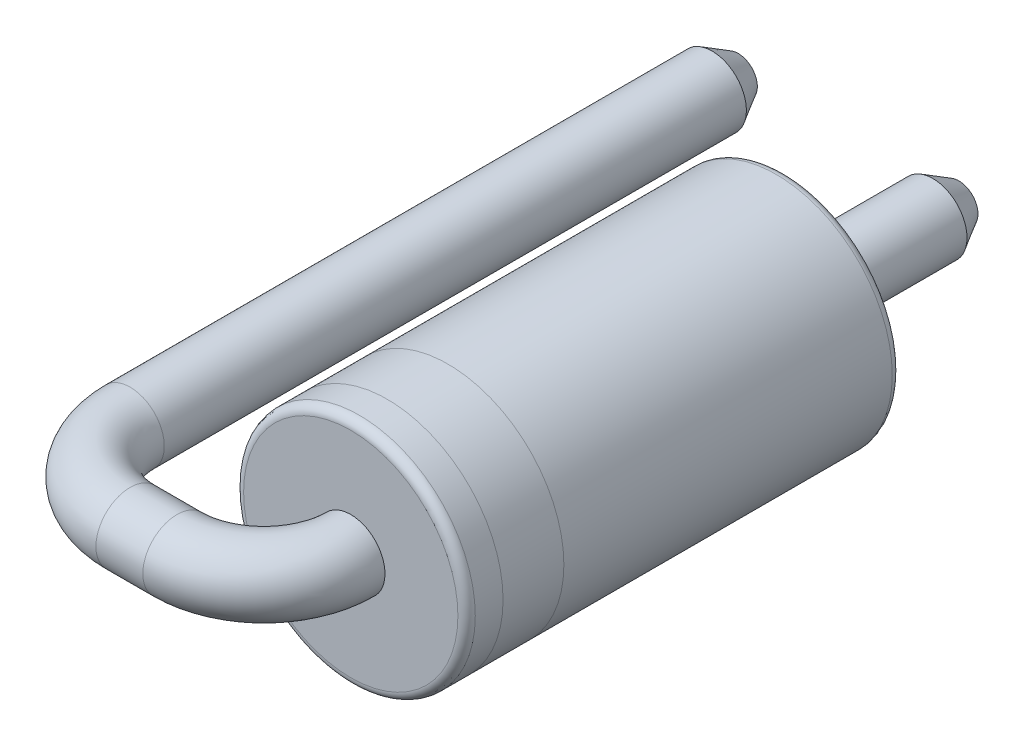
ISO-10303-21;
HEADER;
FILE_DESCRIPTION(('STEP AP214'),'2;1');
FILE_NAME('part.step','',(''),(''),'','','');
FILE_SCHEMA(('AUTOMOTIVE_DESIGN { 1 0 10303 214 1 1 1 1 }'));
ENDSEC;
DATA;
#1=APPLICATION_CONTEXT('core data for automotive mechanical design processes');
#2=APPLICATION_PROTOCOL_DEFINITION('international standard','automotive_design',2000,#1);
#3=PRODUCT_CONTEXT('',#1,'mechanical');
#4=PRODUCT('Part','Part','',(#3));
#5=PRODUCT_RELATED_PRODUCT_CATEGORY('part','',(#4));
#6=PRODUCT_DEFINITION_FORMATION('','',#4);
#7=PRODUCT_DEFINITION_CONTEXT('part definition',#1,'design');
#8=PRODUCT_DEFINITION('design','',#6,#7);
#9=PRODUCT_DEFINITION_SHAPE('','',#8);
#10=(LENGTH_UNIT() NAMED_UNIT(*) SI_UNIT(.MILLI.,.METRE.));
#11=(NAMED_UNIT(*) PLANE_ANGLE_UNIT() SI_UNIT($,.RADIAN.));
#12=(NAMED_UNIT(*) SI_UNIT($,.STERADIAN.) SOLID_ANGLE_UNIT());
#13=UNCERTAINTY_MEASURE_WITH_UNIT(LENGTH_MEASURE(1.E-05),#10,'distance_accuracy_value','');
#14=(GEOMETRIC_REPRESENTATION_CONTEXT(3) GLOBAL_UNCERTAINTY_ASSIGNED_CONTEXT((#13)) GLOBAL_UNIT_ASSIGNED_CONTEXT((#10,
#11,#12)) REPRESENTATION_CONTEXT('',''));
#15=CARTESIAN_POINT('',(0.,0.,0.));
#16=DIRECTION('',(0.,0.,1.));
#17=DIRECTION('',(1.,0.,0.));
#18=AXIS2_PLACEMENT_3D('',#15,#16,#17);
#19=CARTESIAN_POINT('',(1.27,0.,7.));
#20=DIRECTION('',(0.,0.,-1.));
#21=DIRECTION('',(-1.,0.,0.));
#22=AXIS2_PLACEMENT_3D('',#19,#20,#21);
#23=CYLINDRICAL_SURFACE('',#22,1.3335);
#24=CARTESIAN_POINT('',(1.27,0.,2.1));
#25=DIRECTION('',(0.,0.,1.));
#26=DIRECTION('',(1.,0.,0.));
#27=AXIS2_PLACEMENT_3D('',#24,#25,#26);
#28=CIRCLE('',#27,1.3335);
#29=CARTESIAN_POINT('',(2.6035,0.,2.1));
#30=VERTEX_POINT('',#29);
#31=EDGE_CURVE('E50',#30,#30,#28,.T.);
#32=ORIENTED_EDGE('',*,*,#31,.T.);
#33=EDGE_LOOP('',(#32));
#34=FACE_BOUND('',#33,.T.);
#35=CARTESIAN_POINT('',(1.27,0.,5.88021399768316));
#36=DIRECTION('',(0.,0.,1.));
#37=DIRECTION('',(1.,0.,0.));
#38=AXIS2_PLACEMENT_3D('',#35,#36,#37);
#39=CIRCLE('',#38,1.3335);
#40=CARTESIAN_POINT('',(2.6035,0.,5.88021399768316));
#41=VERTEX_POINT('',#40);
#42=EDGE_CURVE('E55',#41,#41,#39,.T.);
#43=ORIENTED_EDGE('',*,*,#42,.F.);
#44=EDGE_LOOP('',(#43));
#45=FACE_BOUND('',#44,.T.);
#46=ADVANCED_FACE('F35',(#34,#45),#23,.T.);
#47=CARTESIAN_POINT('',(1.27,0.,6.9));
#48=DIRECTION('',(0.,0.,1.));
#49=DIRECTION('',(1.,0.,0.));
#50=AXIS2_PLACEMENT_3D('',#47,#48,#49);
#51=CIRCLE('',#50,1.3335);
#52=CARTESIAN_POINT('',(2.6035,0.,6.9));
#53=VERTEX_POINT('',#52);
#54=EDGE_CURVE('E10',#53,#53,#51,.F.);
#55=ORIENTED_EDGE('',*,*,#54,.T.);
#56=EDGE_LOOP('',(#55));
#57=FACE_BOUND('',#56,.T.);
#58=CARTESIAN_POINT('',(1.27,0.,6.58021399768316));
#59=DIRECTION('',(0.,0.,-1.));
#60=DIRECTION('',(-1.,0.,0.));
#61=AXIS2_PLACEMENT_3D('',#58,#59,#60);
#62=CIRCLE('',#61,1.3335);
#63=CARTESIAN_POINT('',(-0.0634999999999989,0.,6.58021399768316));
#64=VERTEX_POINT('',#63);
#65=EDGE_CURVE('E59',#64,#64,#62,.T.);
#66=ORIENTED_EDGE('',*,*,#65,.F.);
#67=EDGE_LOOP('',(#66));
#68=FACE_BOUND('',#67,.T.);
#69=ADVANCED_FACE('F110',(#57,#68),#23,.T.);
#70=CARTESIAN_POINT('',(-1.27,0.,7.));
#71=DIRECTION('',(-7.44568097653188E-13,0.,-1.));
#72=DIRECTION('',(-1.,0.,7.44568097653188E-13));
#73=AXIS2_PLACEMENT_3D('',#70,#71,#72);
#74=CYLINDRICAL_SURFACE('',#73,0.393699999999999);
#75=CARTESIAN_POINT('',(-1.27000000000499,0.,0.299999999999745));
#76=DIRECTION('',(-7.44485491774011E-13,0.,-1.));
#77=DIRECTION('',(-1.,0.,7.44485491774011E-13));
#78=AXIS2_PLACEMENT_3D('',#75,#76,#77);
#79=CIRCLE('',#78,0.393699999999999);
#80=CARTESIAN_POINT('',(-1.66370000000499,0.,0.300000000000038));
#81=VERTEX_POINT('',#80);
#82=EDGE_CURVE('E66',#81,#81,#79,.F.);
#83=ORIENTED_EDGE('',*,*,#82,.T.);
#84=EDGE_LOOP('',(#83));
#85=FACE_BOUND('',#84,.T.);
#86=CARTESIAN_POINT('',(-1.27,0.,7.));
#87=DIRECTION('',(0.,0.,-1.));
#88=DIRECTION('',(-1.,0.,0.));
#89=AXIS2_PLACEMENT_3D('',#86,#87,#88);
#90=CIRCLE('',#89,0.393699999999999);
#91=CARTESIAN_POINT('',(-1.6637,0.,7.));
#92=VERTEX_POINT('',#91);
#93=EDGE_CURVE('E78',#92,#92,#90,.T.);
#94=ORIENTED_EDGE('',*,*,#93,.T.);
#95=EDGE_LOOP('',(#94));
#96=FACE_BOUND('',#95,.T.);
#97=ADVANCED_FACE('F116',(#85,#96),#74,.T.);
#98=CARTESIAN_POINT('',(-0.269999999999999,0.,7.));
#99=DIRECTION('',(0.,-1.,0.));
#100=DIRECTION('',(0.,0.,-1.));
#101=AXIS2_PLACEMENT_3D('',#98,#99,#100);
#102=TOROIDAL_SURFACE('',#101,1.,0.393699999999999);
#103=CARTESIAN_POINT('',(-0.269999999999999,0.,8.));
#104=DIRECTION('',(-1.,0.,0.));
#105=DIRECTION('',(0.,0.,1.));
#106=AXIS2_PLACEMENT_3D('',#103,#104,#105);
#107=CIRCLE('',#106,0.393699999999999);
#108=CARTESIAN_POINT('',(-0.269999999999999,0.,8.3937));
#109=VERTEX_POINT('',#108);
#110=EDGE_CURVE('E81',#109,#109,#107,.T.);
#111=CARTESIAN_POINT('',(-0.269999999999999,0.,7.));
#112=DIRECTION('',(0.,-1.,0.));
#113=DIRECTION('',(0.,0.,-1.));
#114=AXIS2_PLACEMENT_3D('',#111,#112,#113);
#115=CIRCLE('',#114,1.3937);
#116=EDGE_CURVE('',#109,#92,#115,.T.);
#117=ORIENTED_EDGE('',*,*,#110,.T.);
#118=ORIENTED_EDGE('',*,*,#93,.F.);
#119=ORIENTED_EDGE('',*,*,#116,.T.);
#120=ORIENTED_EDGE('',*,*,#116,.F.);
#121=EDGE_LOOP('',(#117,#119,#118,#120));
#122=FACE_BOUND('',#121,.T.);
#123=ADVANCED_FACE('F148',(#122),#102,.T.);
#124=CARTESIAN_POINT('',(0.27,0.,8.));
#125=DIRECTION('',(-1.,0.,0.));
#126=DIRECTION('',(0.,0.,1.));
#127=AXIS2_PLACEMENT_3D('',#124,#125,#126);
#128=CYLINDRICAL_SURFACE('',#127,0.393699999999999);
#129=CARTESIAN_POINT('',(0.27,0.,8.));
#130=DIRECTION('',(-1.,0.,0.));
#131=DIRECTION('',(0.,0.,1.));
#132=AXIS2_PLACEMENT_3D('',#129,#130,#131);
#133=CIRCLE('',#132,0.393699999999999);
#134=CARTESIAN_POINT('',(0.27,0.,8.3937));
#135=VERTEX_POINT('',#134);
#136=EDGE_CURVE('E84',#135,#135,#133,.T.);
#137=ORIENTED_EDGE('',*,*,#136,.T.);
#138=EDGE_LOOP('',(#137));
#139=FACE_BOUND('',#138,.T.);
#140=ORIENTED_EDGE('',*,*,#110,.F.);
#141=EDGE_LOOP('',(#140));
#142=FACE_BOUND('',#141,.T.);
#143=ADVANCED_FACE('F145',(#139,#142),#128,.T.);
#144=CARTESIAN_POINT('',(0.270000000000001,0.,7.));
#145=DIRECTION('',(0.,-1.,0.));
#146=DIRECTION('',(0.,0.,-1.));
#147=AXIS2_PLACEMENT_3D('',#144,#145,#146);
#148=TOROIDAL_SURFACE('',#147,1.,0.393699999999999);
#149=CARTESIAN_POINT('',(1.27,0.,7.));
#150=DIRECTION('',(0.,0.,1.));
#151=DIRECTION('',(1.,0.,0.));
#152=AXIS2_PLACEMENT_3D('',#149,#150,#151);
#153=CIRCLE('',#152,0.393699999999999);
#154=CARTESIAN_POINT('',(1.6637,0.,7.));
#155=VERTEX_POINT('',#154);
#156=EDGE_CURVE('E87',#155,#155,#153,.T.);
#157=CARTESIAN_POINT('',(0.270000000000001,0.,7.));
#158=DIRECTION('',(0.,-1.,0.));
#159=DIRECTION('',(0.,0.,-1.));
#160=AXIS2_PLACEMENT_3D('',#157,#158,#159);
#161=CIRCLE('',#160,1.3937);
#162=EDGE_CURVE('',#155,#135,#161,.T.);
#163=ORIENTED_EDGE('',*,*,#156,.T.);
#164=ORIENTED_EDGE('',*,*,#136,.F.);
#165=ORIENTED_EDGE('',*,*,#162,.T.);
#166=ORIENTED_EDGE('',*,*,#162,.F.);
#167=EDGE_LOOP('',(#163,#165,#164,#166));
#168=FACE_BOUND('',#167,.T.);
#169=ADVANCED_FACE('F91',(#168),#148,.T.);
#170=CARTESIAN_POINT('',(-1.27000000000521,0.,0.));
#171=DIRECTION('',(0.,0.,-1.));
#172=DIRECTION('',(-1.,0.,0.));
#173=AXIS2_PLACEMENT_3D('',#170,#171,#172);
#174=PLANE('',#173);
#175=CARTESIAN_POINT('',(-1.27000000000521,0.,0.));
#176=DIRECTION('',(0.,0.,-1.));
#177=DIRECTION('',(-1.,0.,0.));
#178=AXIS2_PLACEMENT_3D('',#175,#176,#177);
#179=CIRCLE('',#178,0.220494919243537);
#180=CARTESIAN_POINT('',(-1.49049491924875,0.,0.));
#181=VERTEX_POINT('',#180);
#182=EDGE_CURVE('E69',#181,#181,#179,.T.);
#183=ORIENTED_EDGE('',*,*,#182,.T.);
#184=EDGE_LOOP('',(#183));
#185=FACE_BOUND('',#184,.T.);
#186=ADVANCED_FACE('F106',(#185),#174,.T.);
#187=CARTESIAN_POINT('',(-1.27000000000521,0.,0.));
#188=DIRECTION('',(7.44485491774011E-13,0.,1.));
#189=DIRECTION('',(1.,0.,-7.44485491774011E-13));
#190=AXIS2_PLACEMENT_3D('',#187,#188,#189);
#191=CONICAL_SURFACE('',#190,0.220494919243632,0.523598775597366);
#192=ORIENTED_EDGE('',*,*,#82,.F.);
#193=EDGE_LOOP('',(#192));
#194=FACE_BOUND('',#193,.T.);
#195=ORIENTED_EDGE('',*,*,#182,.F.);
#196=EDGE_LOOP('',(#195));
#197=FACE_BOUND('',#196,.T.);
#198=ADVANCED_FACE('F97',(#194,#197),#191,.T.);
#199=CARTESIAN_POINT('',(1.27,0.,7.));
#200=DIRECTION('',(0.,0.,1.));
#201=DIRECTION('',(1.,0.,0.));
#202=AXIS2_PLACEMENT_3D('',#199,#200,#201);
#203=PLANE('',#202);
#204=CARTESIAN_POINT('',(1.27,0.,7.));
#205=DIRECTION('',(0.,0.,1.));
#206=DIRECTION('',(1.,0.,0.));
#207=AXIS2_PLACEMENT_3D('',#204,#205,#206);
#208=CIRCLE('',#207,1.2335);
#209=CARTESIAN_POINT('',(2.5035,0.,7.));
#210=VERTEX_POINT('',#209);
#211=EDGE_CURVE('E42',#210,#210,#208,.T.);
#212=ORIENTED_EDGE('',*,*,#211,.T.);
#213=EDGE_LOOP('',(#212));
#214=FACE_BOUND('',#213,.T.);
#215=ORIENTED_EDGE('',*,*,#156,.F.);
#216=EDGE_LOOP('',(#215));
#217=FACE_BOUND('',#216,.T.);
#218=ADVANCED_FACE('F94',(#214,#217),#203,.T.);
#219=CARTESIAN_POINT('',(1.27,0.,2.));
#220=DIRECTION('',(0.,0.,1.));
#221=DIRECTION('',(1.,0.,0.));
#222=AXIS2_PLACEMENT_3D('',#219,#220,#221);
#223=PLANE('',#222);
#224=CARTESIAN_POINT('',(1.27,0.,2.));
#225=DIRECTION('',(0.,0.,1.));
#226=DIRECTION('',(1.,0.,0.));
#227=AXIS2_PLACEMENT_3D('',#224,#225,#226);
#228=CIRCLE('',#227,1.2335);
#229=CARTESIAN_POINT('',(2.5035,0.,2.));
#230=VERTEX_POINT('',#229);
#231=EDGE_CURVE('E46',#230,#230,#228,.F.);
#232=ORIENTED_EDGE('',*,*,#231,.T.);
#233=EDGE_LOOP('',(#232));
#234=FACE_BOUND('',#233,.T.);
#235=CARTESIAN_POINT('',(1.27,0.,2.));
#236=DIRECTION('',(0.,0.,1.));
#237=DIRECTION('',(1.,0.,0.));
#238=AXIS2_PLACEMENT_3D('',#235,#236,#237);
#239=CIRCLE('',#238,0.393699999999999);
#240=CARTESIAN_POINT('',(1.6637,0.,2.));
#241=VERTEX_POINT('',#240);
#242=EDGE_CURVE('E63',#241,#241,#239,.T.);
#243=ORIENTED_EDGE('',*,*,#242,.T.);
#244=EDGE_LOOP('',(#243));
#245=FACE_BOUND('',#244,.T.);
#246=ADVANCED_FACE('F96',(#234,#245),#223,.F.);
#247=ORIENTED_EDGE('',*,*,#42,.T.);
#248=EDGE_LOOP('',(#247));
#249=FACE_BOUND('',#248,.T.);
#250=ORIENTED_EDGE('',*,*,#65,.T.);
#251=EDGE_LOOP('',(#250));
#252=FACE_BOUND('',#251,.T.);
#253=ADVANCED_FACE('F103',(#249,#252),#23,.T.);
#254=CARTESIAN_POINT('',(1.27,0.,0.));
#255=DIRECTION('',(0.,0.,1.));
#256=DIRECTION('',(1.,0.,0.));
#257=AXIS2_PLACEMENT_3D('',#254,#255,#256);
#258=PLANE('',#257);
#259=CARTESIAN_POINT('',(1.27,0.,0.));
#260=DIRECTION('',(0.,0.,1.));
#261=DIRECTION('',(1.,0.,0.));
#262=AXIS2_PLACEMENT_3D('',#259,#260,#261);
#263=CIRCLE('',#262,0.220494919243112);
#264=CARTESIAN_POINT('',(1.49049491924311,0.,0.));
#265=VERTEX_POINT('',#264);
#266=EDGE_CURVE('E72',#265,#265,#263,.F.);
#267=ORIENTED_EDGE('',*,*,#266,.T.);
#268=EDGE_LOOP('',(#267));
#269=FACE_BOUND('',#268,.T.);
#270=ADVANCED_FACE('F120',(#269),#258,.F.);
#271=CARTESIAN_POINT('',(1.27,0.,0.3));
#272=DIRECTION('',(0.,0.,1.));
#273=DIRECTION('',(1.,0.,0.));
#274=AXIS2_PLACEMENT_3D('',#271,#272,#273);
#275=CONICAL_SURFACE('',#274,0.393699999999999,0.523598775598298);
#276=ORIENTED_EDGE('',*,*,#266,.F.);
#277=EDGE_LOOP('',(#276));
#278=FACE_BOUND('',#277,.T.);
#279=CARTESIAN_POINT('',(1.27,0.,0.3));
#280=DIRECTION('',(0.,0.,1.));
#281=DIRECTION('',(1.,0.,0.));
#282=AXIS2_PLACEMENT_3D('',#279,#280,#281);
#283=CIRCLE('',#282,0.393699999999999);
#284=CARTESIAN_POINT('',(1.6637,0.,0.3));
#285=VERTEX_POINT('',#284);
#286=EDGE_CURVE('E75',#285,#285,#283,.T.);
#287=ORIENTED_EDGE('',*,*,#286,.F.);
#288=EDGE_LOOP('',(#287));
#289=FACE_BOUND('',#288,.T.);
#290=ADVANCED_FACE('F125',(#278,#289),#275,.T.);
#291=CARTESIAN_POINT('',(1.27,0.,7.));
#292=DIRECTION('',(0.,0.,-1.));
#293=DIRECTION('',(-1.,0.,0.));
#294=AXIS2_PLACEMENT_3D('',#291,#292,#293);
#295=CYLINDRICAL_SURFACE('',#294,0.393699999999999);
#296=ORIENTED_EDGE('',*,*,#286,.T.);
#297=EDGE_LOOP('',(#296));
#298=FACE_BOUND('',#297,.T.);
#299=ORIENTED_EDGE('',*,*,#242,.F.);
#300=EDGE_LOOP('',(#299));
#301=FACE_BOUND('',#300,.T.);
#302=ADVANCED_FACE('F135',(#298,#301),#295,.T.);
#303=CARTESIAN_POINT('',(1.27,0.,2.1));
#304=DIRECTION('',(0.,0.,1.));
#305=DIRECTION('',(1.,0.,0.));
#306=AXIS2_PLACEMENT_3D('',#303,#304,#305);
#307=TOROIDAL_SURFACE('',#306,1.2335,0.1);
#308=ORIENTED_EDGE('',*,*,#231,.F.);
#309=EDGE_LOOP('',(#308));
#310=FACE_BOUND('',#309,.T.);
#311=ORIENTED_EDGE('',*,*,#31,.F.);
#312=EDGE_LOOP('',(#311));
#313=FACE_BOUND('',#312,.T.);
#314=ADVANCED_FACE('F141',(#310,#313),#307,.T.);
#315=CARTESIAN_POINT('',(1.27,0.,6.9));
#316=DIRECTION('',(0.,0.,1.));
#317=DIRECTION('',(1.,0.,0.));
#318=AXIS2_PLACEMENT_3D('',#315,#316,#317);
#319=TOROIDAL_SURFACE('',#318,1.2335,0.1);
#320=ORIENTED_EDGE('',*,*,#54,.F.);
#321=EDGE_LOOP('',(#320));
#322=FACE_BOUND('',#321,.T.);
#323=ORIENTED_EDGE('',*,*,#211,.F.);
#324=EDGE_LOOP('',(#323));
#325=FACE_BOUND('',#324,.T.);
#326=ADVANCED_FACE('F37',(#322,#325),#319,.T.);
#327=CLOSED_SHELL('',(#46,#69,#97,#123,#143,#169,#186,#198,#218,#246,#253,#270,#290,#302,#314,#326));
#328=MANIFOLD_SOLID_BREP('B2',#327);
#329=ADVANCED_BREP_SHAPE_REPRESENTATION('',(#18,#328),#14);
#330=SHAPE_DEFINITION_REPRESENTATION(#9,#329);
ENDSEC;
END-ISO-10303-21;
